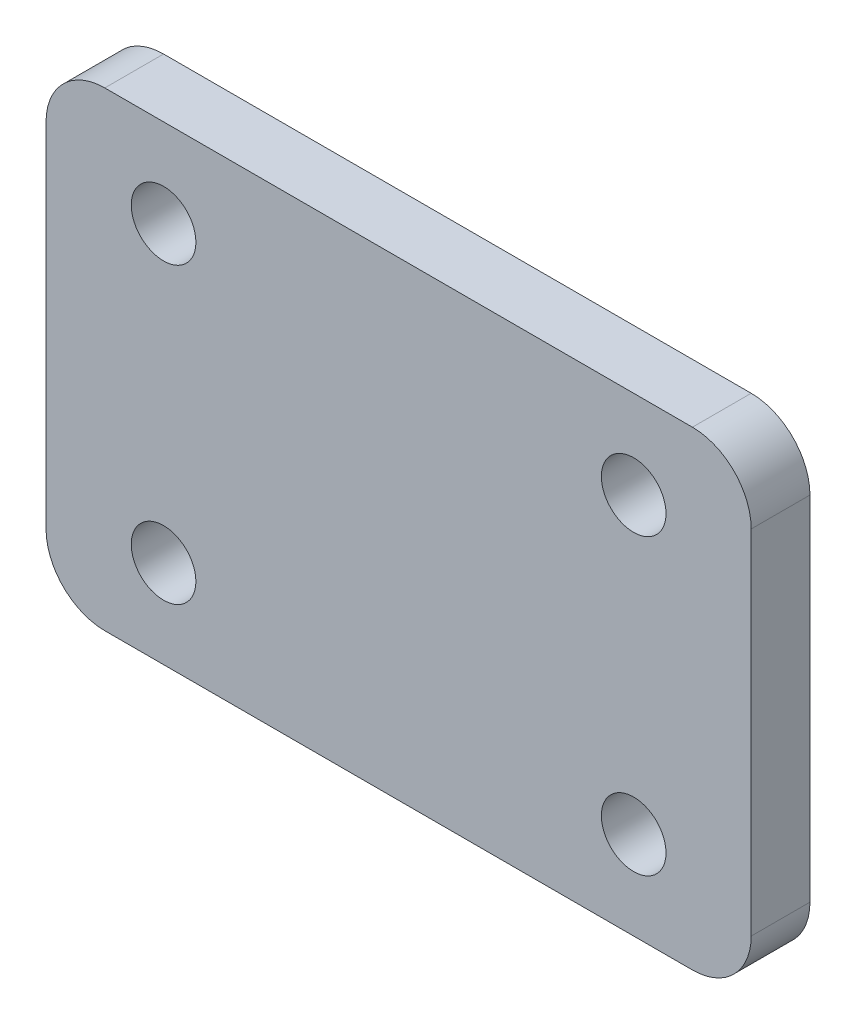
ISO-10303-21;
HEADER;
FILE_DESCRIPTION(('STEP AP214'),'2;1');
FILE_NAME('part.step','',(''),(''),'','','');
FILE_SCHEMA(('AUTOMOTIVE_DESIGN { 1 0 10303 214 1 1 1 1 }'));
ENDSEC;
DATA;
#1=APPLICATION_CONTEXT('core data for automotive mechanical design processes');
#2=APPLICATION_PROTOCOL_DEFINITION('international standard','automotive_design',2000,#1);
#3=PRODUCT_CONTEXT('',#1,'mechanical');
#4=PRODUCT('Part','Part','',(#3));
#5=PRODUCT_RELATED_PRODUCT_CATEGORY('part','',(#4));
#6=PRODUCT_DEFINITION_FORMATION('','',#4);
#7=PRODUCT_DEFINITION_CONTEXT('part definition',#1,'design');
#8=PRODUCT_DEFINITION('design','',#6,#7);
#9=PRODUCT_DEFINITION_SHAPE('','',#8);
#10=(LENGTH_UNIT() NAMED_UNIT(*) SI_UNIT(.MILLI.,.METRE.));
#11=(NAMED_UNIT(*) PLANE_ANGLE_UNIT() SI_UNIT($,.RADIAN.));
#12=(NAMED_UNIT(*) SI_UNIT($,.STERADIAN.) SOLID_ANGLE_UNIT());
#13=UNCERTAINTY_MEASURE_WITH_UNIT(LENGTH_MEASURE(1.E-05),#10,'distance_accuracy_value','');
#14=(GEOMETRIC_REPRESENTATION_CONTEXT(3) GLOBAL_UNCERTAINTY_ASSIGNED_CONTEXT((#13)) GLOBAL_UNIT_ASSIGNED_CONTEXT((#10,
#11,#12)) REPRESENTATION_CONTEXT('',''));
#15=CARTESIAN_POINT('',(0.,0.,0.));
#16=DIRECTION('',(0.,0.,1.));
#17=DIRECTION('',(1.,0.,0.));
#18=AXIS2_PLACEMENT_3D('',#15,#16,#17);
#19=CARTESIAN_POINT('',(60.,40.,-9.99999999999999));
#20=DIRECTION('',(1.,0.,0.));
#21=DIRECTION('',(0.,1.,0.));
#22=AXIS2_PLACEMENT_3D('',#19,#20,#21);
#23=PLANE('',#22);
#24=DIRECTION('',(0.,1.,0.));
#25=VECTOR('',#24,1.);
#26=CARTESIAN_POINT('',(60.,40.,-9.99999999999999));
#27=LINE('',#26,#25);
#28=CARTESIAN_POINT('',(60.,-30.,-9.99999999999999));
#29=VERTEX_POINT('',#28);
#30=CARTESIAN_POINT('',(60.,30.,-9.99999999999999));
#31=VERTEX_POINT('',#30);
#32=EDGE_CURVE('E214',#29,#31,#27,.T.);
#33=ORIENTED_EDGE('',*,*,#32,.T.);
#34=DIRECTION('',(0.,0.,1.));
#35=VECTOR('',#34,1.);
#36=CARTESIAN_POINT('',(60.,30.,-9.99999999999999));
#37=LINE('',#36,#35);
#38=CARTESIAN_POINT('',(60.,30.,0.));
#39=VERTEX_POINT('',#38);
#40=EDGE_CURVE('E132',#31,#39,#37,.T.);
#41=ORIENTED_EDGE('',*,*,#40,.T.);
#42=DIRECTION('',(0.,1.,0.));
#43=VECTOR('',#42,1.);
#44=CARTESIAN_POINT('',(60.,40.,0.));
#45=LINE('',#44,#43);
#46=CARTESIAN_POINT('',(60.,-30.,0.));
#47=VERTEX_POINT('',#46);
#48=EDGE_CURVE('E115',#47,#39,#45,.T.);
#49=ORIENTED_EDGE('',*,*,#48,.F.);
#50=DIRECTION('',(0.,0.,1.));
#51=VECTOR('',#50,1.);
#52=CARTESIAN_POINT('',(60.,-30.,-9.99999999999999));
#53=LINE('',#52,#51);
#54=EDGE_CURVE('E129',#47,#29,#53,.F.);
#55=ORIENTED_EDGE('',*,*,#54,.T.);
#56=EDGE_LOOP('',(#33,#41,#49,#55));
#57=FACE_BOUND('',#56,.T.);
#58=ADVANCED_FACE('F45',(#57),#23,.T.);
#59=CARTESIAN_POINT('',(-60.,-40.,-9.99999999999999));
#60=DIRECTION('',(0.,-1.,0.));
#61=DIRECTION('',(0.,0.,-1.));
#62=AXIS2_PLACEMENT_3D('',#59,#60,#61);
#63=PLANE('',#62);
#64=DIRECTION('',(1.,0.,0.));
#65=VECTOR('',#64,1.);
#66=CARTESIAN_POINT('',(-60.,-40.,-9.99999999999999));
#67=LINE('',#66,#65);
#68=CARTESIAN_POINT('',(-50.,-40.,-9.99999999999999));
#69=VERTEX_POINT('',#68);
#70=CARTESIAN_POINT('',(50.,-40.,-9.99999999999999));
#71=VERTEX_POINT('',#70);
#72=EDGE_CURVE('E141',#69,#71,#67,.T.);
#73=ORIENTED_EDGE('',*,*,#72,.T.);
#74=DIRECTION('',(0.,0.,1.));
#75=VECTOR('',#74,1.);
#76=CARTESIAN_POINT('',(50.,-40.,-9.99999999999999));
#77=LINE('',#76,#75);
#78=CARTESIAN_POINT('',(50.,-40.,0.));
#79=VERTEX_POINT('',#78);
#80=EDGE_CURVE('E180',#71,#79,#77,.T.);
#81=ORIENTED_EDGE('',*,*,#80,.T.);
#82=DIRECTION('',(1.,0.,0.));
#83=VECTOR('',#82,1.);
#84=CARTESIAN_POINT('',(-60.,-40.,0.));
#85=LINE('',#84,#83);
#86=CARTESIAN_POINT('',(-50.,-40.,0.));
#87=VERTEX_POINT('',#86);
#88=EDGE_CURVE('E117',#87,#79,#85,.T.);
#89=ORIENTED_EDGE('',*,*,#88,.F.);
#90=DIRECTION('',(0.,0.,1.));
#91=VECTOR('',#90,1.);
#92=CARTESIAN_POINT('',(-50.,-40.,-9.99999999999999));
#93=LINE('',#92,#91);
#94=EDGE_CURVE('E177',#87,#69,#93,.F.);
#95=ORIENTED_EDGE('',*,*,#94,.T.);
#96=EDGE_LOOP('',(#73,#81,#89,#95));
#97=FACE_BOUND('',#96,.T.);
#98=ADVANCED_FACE('F199',(#97),#63,.T.);
#99=CARTESIAN_POINT('',(-60.,40.,-9.99999999999999));
#100=DIRECTION('',(-1.,0.,0.));
#101=DIRECTION('',(0.,0.,1.));
#102=AXIS2_PLACEMENT_3D('',#99,#100,#101);
#103=PLANE('',#102);
#104=DIRECTION('',(0.,-1.,0.));
#105=VECTOR('',#104,1.);
#106=CARTESIAN_POINT('',(-60.,40.,-9.99999999999999));
#107=LINE('',#106,#105);
#108=CARTESIAN_POINT('',(-60.,30.,-10.));
#109=VERTEX_POINT('',#108);
#110=CARTESIAN_POINT('',(-60.,-30.,-10.));
#111=VERTEX_POINT('',#110);
#112=EDGE_CURVE('E149',#109,#111,#107,.T.);
#113=ORIENTED_EDGE('',*,*,#112,.T.);
#114=DIRECTION('',(0.,0.,1.));
#115=VECTOR('',#114,1.);
#116=CARTESIAN_POINT('',(-60.,-30.,-10.));
#117=LINE('',#116,#115);
#118=CARTESIAN_POINT('',(-60.,-30.,0.));
#119=VERTEX_POINT('',#118);
#120=EDGE_CURVE('E11',#111,#119,#117,.T.);
#121=ORIENTED_EDGE('',*,*,#120,.T.);
#122=DIRECTION('',(0.,-1.,0.));
#123=VECTOR('',#122,1.);
#124=CARTESIAN_POINT('',(-60.,40.,0.));
#125=LINE('',#124,#123);
#126=CARTESIAN_POINT('',(-60.,30.,0.));
#127=VERTEX_POINT('',#126);
#128=EDGE_CURVE('E208',#127,#119,#125,.T.);
#129=ORIENTED_EDGE('',*,*,#128,.F.);
#130=DIRECTION('',(0.,0.,1.));
#131=VECTOR('',#130,1.);
#132=CARTESIAN_POINT('',(-60.,30.,-10.));
#133=LINE('',#132,#131);
#134=EDGE_CURVE('E54',#127,#109,#133,.F.);
#135=ORIENTED_EDGE('',*,*,#134,.T.);
#136=EDGE_LOOP('',(#113,#121,#129,#135));
#137=FACE_BOUND('',#136,.T.);
#138=ADVANCED_FACE('F207',(#137),#103,.T.);
#139=CARTESIAN_POINT('',(-60.,40.,-9.99999999999999));
#140=DIRECTION('',(0.,1.,0.));
#141=DIRECTION('',(0.,0.,1.));
#142=AXIS2_PLACEMENT_3D('',#139,#140,#141);
#143=PLANE('',#142);
#144=DIRECTION('',(-1.,0.,0.));
#145=VECTOR('',#144,1.);
#146=CARTESIAN_POINT('',(-60.,40.,0.));
#147=LINE('',#146,#145);
#148=CARTESIAN_POINT('',(50.,40.,0.));
#149=VERTEX_POINT('',#148);
#150=CARTESIAN_POINT('',(-50.,40.,0.));
#151=VERTEX_POINT('',#150);
#152=EDGE_CURVE('E134',#149,#151,#147,.T.);
#153=ORIENTED_EDGE('',*,*,#152,.F.);
#154=DIRECTION('',(0.,0.,1.));
#155=VECTOR('',#154,1.);
#156=CARTESIAN_POINT('',(50.,40.,-9.99999999999999));
#157=LINE('',#156,#155);
#158=CARTESIAN_POINT('',(50.,40.,-9.99999999999999));
#159=VERTEX_POINT('',#158);
#160=EDGE_CURVE('E164',#149,#159,#157,.F.);
#161=ORIENTED_EDGE('',*,*,#160,.T.);
#162=DIRECTION('',(-1.,0.,0.));
#163=VECTOR('',#162,1.);
#164=CARTESIAN_POINT('',(-60.,40.,-9.99999999999999));
#165=LINE('',#164,#163);
#166=CARTESIAN_POINT('',(-50.,40.,-9.99999999999999));
#167=VERTEX_POINT('',#166);
#168=EDGE_CURVE('E219',#159,#167,#165,.T.);
#169=ORIENTED_EDGE('',*,*,#168,.T.);
#170=DIRECTION('',(0.,0.,1.));
#171=VECTOR('',#170,1.);
#172=CARTESIAN_POINT('',(-50.,40.,-9.99999999999999));
#173=LINE('',#172,#171);
#174=EDGE_CURVE('E160',#167,#151,#173,.T.);
#175=ORIENTED_EDGE('',*,*,#174,.T.);
#176=EDGE_LOOP('',(#153,#161,#169,#175));
#177=FACE_BOUND('',#176,.T.);
#178=ADVANCED_FACE('F274',(#177),#143,.T.);
#179=CARTESIAN_POINT('',(0.,0.,-9.99999999999999));
#180=DIRECTION('',(0.,0.,1.));
#181=DIRECTION('',(1.,0.,0.));
#182=AXIS2_PLACEMENT_3D('',#179,#180,#181);
#183=PLANE('',#182);
#184=CARTESIAN_POINT('',(40.,25.,-10.));
#185=DIRECTION('',(0.,0.,1.));
#186=DIRECTION('',(1.,0.,0.));
#187=AXIS2_PLACEMENT_3D('',#184,#185,#186);
#188=CIRCLE('',#187,5.5);
#189=CARTESIAN_POINT('',(45.5,25.,-10.));
#190=VERTEX_POINT('',#189);
#191=EDGE_CURVE('E135',#190,#190,#188,.T.);
#192=ORIENTED_EDGE('',*,*,#191,.T.);
#193=EDGE_LOOP('',(#192));
#194=FACE_BOUND('',#193,.T.);
#195=CARTESIAN_POINT('',(40.,-25.,-10.));
#196=DIRECTION('',(0.,0.,1.));
#197=DIRECTION('',(1.,0.,0.));
#198=AXIS2_PLACEMENT_3D('',#195,#196,#197);
#199=CIRCLE('',#198,5.5);
#200=CARTESIAN_POINT('',(45.5,-25.,-10.));
#201=VERTEX_POINT('',#200);
#202=EDGE_CURVE('E228',#201,#201,#199,.T.);
#203=ORIENTED_EDGE('',*,*,#202,.T.);
#204=EDGE_LOOP('',(#203));
#205=FACE_BOUND('',#204,.T.);
#206=CARTESIAN_POINT('',(-40.,-25.,-9.99999999999999));
#207=DIRECTION('',(0.,0.,1.));
#208=DIRECTION('',(1.,0.,0.));
#209=AXIS2_PLACEMENT_3D('',#206,#207,#208);
#210=CIRCLE('',#209,5.5);
#211=CARTESIAN_POINT('',(-34.5,-25.,-9.99999999999999));
#212=VERTEX_POINT('',#211);
#213=EDGE_CURVE('E232',#212,#212,#210,.T.);
#214=ORIENTED_EDGE('',*,*,#213,.T.);
#215=EDGE_LOOP('',(#214));
#216=FACE_BOUND('',#215,.T.);
#217=CARTESIAN_POINT('',(-40.,25.,-9.99999999999999));
#218=DIRECTION('',(0.,0.,1.));
#219=DIRECTION('',(1.,0.,0.));
#220=AXIS2_PLACEMENT_3D('',#217,#218,#219);
#221=CIRCLE('',#220,5.5);
#222=CARTESIAN_POINT('',(-34.5,25.,-9.99999999999999));
#223=VERTEX_POINT('',#222);
#224=EDGE_CURVE('E236',#223,#223,#221,.T.);
#225=ORIENTED_EDGE('',*,*,#224,.T.);
#226=EDGE_LOOP('',(#225));
#227=FACE_BOUND('',#226,.T.);
#228=ORIENTED_EDGE('',*,*,#168,.F.);
#229=CARTESIAN_POINT('',(50.,30.,-10.));
#230=DIRECTION('',(0.,0.,1.));
#231=DIRECTION('',(1.,0.,0.));
#232=AXIS2_PLACEMENT_3D('',#229,#230,#231);
#233=CIRCLE('',#232,10.);
#234=EDGE_CURVE('E174',#159,#31,#233,.F.);
#235=ORIENTED_EDGE('',*,*,#234,.T.);
#236=ORIENTED_EDGE('',*,*,#32,.F.);
#237=CARTESIAN_POINT('',(50.,-30.,-10.));
#238=DIRECTION('',(0.,0.,1.));
#239=DIRECTION('',(1.,0.,0.));
#240=AXIS2_PLACEMENT_3D('',#237,#238,#239);
#241=CIRCLE('',#240,10.);
#242=EDGE_CURVE('E139',#29,#71,#241,.F.);
#243=ORIENTED_EDGE('',*,*,#242,.T.);
#244=ORIENTED_EDGE('',*,*,#72,.F.);
#245=CARTESIAN_POINT('',(-50.,-30.,-9.99999999999999));
#246=DIRECTION('',(0.,0.,1.));
#247=DIRECTION('',(1.,0.,0.));
#248=AXIS2_PLACEMENT_3D('',#245,#246,#247);
#249=CIRCLE('',#248,10.);
#250=EDGE_CURVE('E61',#69,#111,#249,.F.);
#251=ORIENTED_EDGE('',*,*,#250,.T.);
#252=ORIENTED_EDGE('',*,*,#112,.F.);
#253=CARTESIAN_POINT('',(-50.,30.,-9.99999999999999));
#254=DIRECTION('',(0.,0.,1.));
#255=DIRECTION('',(1.,0.,0.));
#256=AXIS2_PLACEMENT_3D('',#253,#254,#255);
#257=CIRCLE('',#256,10.);
#258=EDGE_CURVE('E167',#109,#167,#257,.F.);
#259=ORIENTED_EDGE('',*,*,#258,.T.);
#260=EDGE_LOOP('',(#228,#235,#236,#243,#244,#251,#252,#259));
#261=FACE_BOUND('',#260,.T.);
#262=ADVANCED_FACE('F202',(#194,#205,#216,#227,#261),#183,.F.);
#263=CARTESIAN_POINT('',(0.,0.,0.));
#264=DIRECTION('',(0.,0.,1.));
#265=DIRECTION('',(1.,0.,0.));
#266=AXIS2_PLACEMENT_3D('',#263,#264,#265);
#267=PLANE('',#266);
#268=CARTESIAN_POINT('',(40.,25.,0.));
#269=DIRECTION('',(0.,0.,1.));
#270=DIRECTION('',(1.,0.,0.));
#271=AXIS2_PLACEMENT_3D('',#268,#269,#270);
#272=CIRCLE('',#271,5.5);
#273=CARTESIAN_POINT('',(45.5,25.,0.));
#274=VERTEX_POINT('',#273);
#275=EDGE_CURVE('E245',#274,#274,#272,.T.);
#276=ORIENTED_EDGE('',*,*,#275,.F.);
#277=EDGE_LOOP('',(#276));
#278=FACE_BOUND('',#277,.T.);
#279=CARTESIAN_POINT('',(40.,-25.,0.));
#280=DIRECTION('',(0.,0.,1.));
#281=DIRECTION('',(1.,0.,0.));
#282=AXIS2_PLACEMENT_3D('',#279,#280,#281);
#283=CIRCLE('',#282,5.5);
#284=CARTESIAN_POINT('',(45.5,-25.,0.));
#285=VERTEX_POINT('',#284);
#286=EDGE_CURVE('E249',#285,#285,#283,.T.);
#287=ORIENTED_EDGE('',*,*,#286,.F.);
#288=EDGE_LOOP('',(#287));
#289=FACE_BOUND('',#288,.T.);
#290=CARTESIAN_POINT('',(-40.,-25.,0.));
#291=DIRECTION('',(0.,0.,1.));
#292=DIRECTION('',(1.,0.,0.));
#293=AXIS2_PLACEMENT_3D('',#290,#291,#292);
#294=CIRCLE('',#293,5.5);
#295=CARTESIAN_POINT('',(-34.5,-25.,0.));
#296=VERTEX_POINT('',#295);
#297=EDGE_CURVE('E244',#296,#296,#294,.T.);
#298=ORIENTED_EDGE('',*,*,#297,.F.);
#299=EDGE_LOOP('',(#298));
#300=FACE_BOUND('',#299,.T.);
#301=CARTESIAN_POINT('',(-40.,25.,0.));
#302=DIRECTION('',(0.,0.,1.));
#303=DIRECTION('',(1.,0.,0.));
#304=AXIS2_PLACEMENT_3D('',#301,#302,#303);
#305=CIRCLE('',#304,5.5);
#306=CARTESIAN_POINT('',(-34.5,25.,0.));
#307=VERTEX_POINT('',#306);
#308=EDGE_CURVE('E240',#307,#307,#305,.T.);
#309=ORIENTED_EDGE('',*,*,#308,.F.);
#310=EDGE_LOOP('',(#309));
#311=FACE_BOUND('',#310,.T.);
#312=ORIENTED_EDGE('',*,*,#48,.T.);
#313=CARTESIAN_POINT('',(50.,30.,0.));
#314=DIRECTION('',(0.,0.,1.));
#315=DIRECTION('',(1.,0.,0.));
#316=AXIS2_PLACEMENT_3D('',#313,#314,#315);
#317=CIRCLE('',#316,10.);
#318=EDGE_CURVE('E123',#39,#149,#317,.T.);
#319=ORIENTED_EDGE('',*,*,#318,.T.);
#320=ORIENTED_EDGE('',*,*,#152,.T.);
#321=CARTESIAN_POINT('',(-50.,30.,0.));
#322=DIRECTION('',(0.,0.,1.));
#323=DIRECTION('',(1.,0.,0.));
#324=AXIS2_PLACEMENT_3D('',#321,#322,#323);
#325=CIRCLE('',#324,10.);
#326=EDGE_CURVE('E146',#151,#127,#325,.T.);
#327=ORIENTED_EDGE('',*,*,#326,.T.);
#328=ORIENTED_EDGE('',*,*,#128,.T.);
#329=CARTESIAN_POINT('',(-50.,-30.,0.));
#330=DIRECTION('',(0.,0.,1.));
#331=DIRECTION('',(1.,0.,0.));
#332=AXIS2_PLACEMENT_3D('',#329,#330,#331);
#333=CIRCLE('',#332,10.);
#334=EDGE_CURVE('E124',#119,#87,#333,.T.);
#335=ORIENTED_EDGE('',*,*,#334,.T.);
#336=ORIENTED_EDGE('',*,*,#88,.T.);
#337=CARTESIAN_POINT('',(50.,-30.,0.));
#338=DIRECTION('',(0.,0.,1.));
#339=DIRECTION('',(1.,0.,0.));
#340=AXIS2_PLACEMENT_3D('',#337,#338,#339);
#341=CIRCLE('',#340,10.);
#342=EDGE_CURVE('E112',#79,#47,#341,.T.);
#343=ORIENTED_EDGE('',*,*,#342,.T.);
#344=EDGE_LOOP('',(#312,#319,#320,#327,#328,#335,#336,#343));
#345=FACE_BOUND('',#344,.T.);
#346=ADVANCED_FACE('F114',(#278,#289,#300,#311,#345),#267,.T.);
#347=CARTESIAN_POINT('',(-40.,25.,-18.));
#348=DIRECTION('',(0.,0.,1.));
#349=DIRECTION('',(1.,0.,0.));
#350=AXIS2_PLACEMENT_3D('',#347,#348,#349);
#351=CYLINDRICAL_SURFACE('',#350,5.5);
#352=ORIENTED_EDGE('',*,*,#308,.T.);
#353=EDGE_LOOP('',(#352));
#354=FACE_BOUND('',#353,.T.);
#355=ORIENTED_EDGE('',*,*,#224,.F.);
#356=EDGE_LOOP('',(#355));
#357=FACE_BOUND('',#356,.T.);
#358=ADVANCED_FACE('F263',(#354,#357),#351,.F.);
#359=CARTESIAN_POINT('',(-40.,-25.,-18.));
#360=DIRECTION('',(0.,0.,1.));
#361=DIRECTION('',(1.,0.,0.));
#362=AXIS2_PLACEMENT_3D('',#359,#360,#361);
#363=CYLINDRICAL_SURFACE('',#362,5.5);
#364=ORIENTED_EDGE('',*,*,#297,.T.);
#365=EDGE_LOOP('',(#364));
#366=FACE_BOUND('',#365,.T.);
#367=ORIENTED_EDGE('',*,*,#213,.F.);
#368=EDGE_LOOP('',(#367));
#369=FACE_BOUND('',#368,.T.);
#370=ADVANCED_FACE('F258',(#366,#369),#363,.F.);
#371=CARTESIAN_POINT('',(40.,-25.,-18.));
#372=DIRECTION('',(0.,0.,1.));
#373=DIRECTION('',(1.,0.,0.));
#374=AXIS2_PLACEMENT_3D('',#371,#372,#373);
#375=CYLINDRICAL_SURFACE('',#374,5.5);
#376=ORIENTED_EDGE('',*,*,#286,.T.);
#377=EDGE_LOOP('',(#376));
#378=FACE_BOUND('',#377,.T.);
#379=ORIENTED_EDGE('',*,*,#202,.F.);
#380=EDGE_LOOP('',(#379));
#381=FACE_BOUND('',#380,.T.);
#382=ADVANCED_FACE('F334',(#378,#381),#375,.F.);
#383=CARTESIAN_POINT('',(40.,25.,-18.));
#384=DIRECTION('',(0.,0.,1.));
#385=DIRECTION('',(1.,0.,0.));
#386=AXIS2_PLACEMENT_3D('',#383,#384,#385);
#387=CYLINDRICAL_SURFACE('',#386,5.5);
#388=ORIENTED_EDGE('',*,*,#275,.T.);
#389=EDGE_LOOP('',(#388));
#390=FACE_BOUND('',#389,.T.);
#391=ORIENTED_EDGE('',*,*,#191,.F.);
#392=EDGE_LOOP('',(#391));
#393=FACE_BOUND('',#392,.T.);
#394=ADVANCED_FACE('F294',(#390,#393),#387,.F.);
#395=CARTESIAN_POINT('',(50.,30.,-10.));
#396=DIRECTION('',(0.,0.,1.));
#397=DIRECTION('',(1.,0.,0.));
#398=AXIS2_PLACEMENT_3D('',#395,#396,#397);
#399=CYLINDRICAL_SURFACE('',#398,10.);
#400=ORIENTED_EDGE('',*,*,#234,.F.);
#401=ORIENTED_EDGE('',*,*,#160,.F.);
#402=ORIENTED_EDGE('',*,*,#318,.F.);
#403=ORIENTED_EDGE('',*,*,#40,.F.);
#404=EDGE_LOOP('',(#400,#401,#402,#403));
#405=FACE_BOUND('',#404,.T.);
#406=ADVANCED_FACE('F291',(#405),#399,.T.);
#407=CARTESIAN_POINT('',(50.,-30.,-10.));
#408=DIRECTION('',(0.,0.,1.));
#409=DIRECTION('',(1.,0.,0.));
#410=AXIS2_PLACEMENT_3D('',#407,#408,#409);
#411=CYLINDRICAL_SURFACE('',#410,10.);
#412=ORIENTED_EDGE('',*,*,#242,.F.);
#413=ORIENTED_EDGE('',*,*,#54,.F.);
#414=ORIENTED_EDGE('',*,*,#342,.F.);
#415=ORIENTED_EDGE('',*,*,#80,.F.);
#416=EDGE_LOOP('',(#412,#413,#414,#415));
#417=FACE_BOUND('',#416,.T.);
#418=ADVANCED_FACE('F138',(#417),#411,.T.);
#419=CARTESIAN_POINT('',(-50.,-30.,-9.99999999999999));
#420=DIRECTION('',(0.,0.,1.));
#421=DIRECTION('',(1.,0.,0.));
#422=AXIS2_PLACEMENT_3D('',#419,#420,#421);
#423=CYLINDRICAL_SURFACE('',#422,10.);
#424=ORIENTED_EDGE('',*,*,#250,.F.);
#425=ORIENTED_EDGE('',*,*,#94,.F.);
#426=ORIENTED_EDGE('',*,*,#334,.F.);
#427=ORIENTED_EDGE('',*,*,#120,.F.);
#428=EDGE_LOOP('',(#424,#425,#426,#427));
#429=FACE_BOUND('',#428,.T.);
#430=ADVANCED_FACE('F205',(#429),#423,.T.);
#431=CARTESIAN_POINT('',(-50.,30.,-9.99999999999999));
#432=DIRECTION('',(0.,0.,1.));
#433=DIRECTION('',(1.,0.,0.));
#434=AXIS2_PLACEMENT_3D('',#431,#432,#433);
#435=CYLINDRICAL_SURFACE('',#434,10.);
#436=ORIENTED_EDGE('',*,*,#258,.F.);
#437=ORIENTED_EDGE('',*,*,#134,.F.);
#438=ORIENTED_EDGE('',*,*,#326,.F.);
#439=ORIENTED_EDGE('',*,*,#174,.F.);
#440=EDGE_LOOP('',(#436,#437,#438,#439));
#441=FACE_BOUND('',#440,.T.);
#442=ADVANCED_FACE('F47',(#441),#435,.T.);
#443=CLOSED_SHELL('',(#58,#98,#138,#178,#262,#346,#358,#370,#382,#394,#406,#418,#430,#442));
#444=MANIFOLD_SOLID_BREP('B2',#443);
#445=ADVANCED_BREP_SHAPE_REPRESENTATION('',(#18,#444),#14);
#446=SHAPE_DEFINITION_REPRESENTATION(#9,#445);
ENDSEC;
END-ISO-10303-21;
